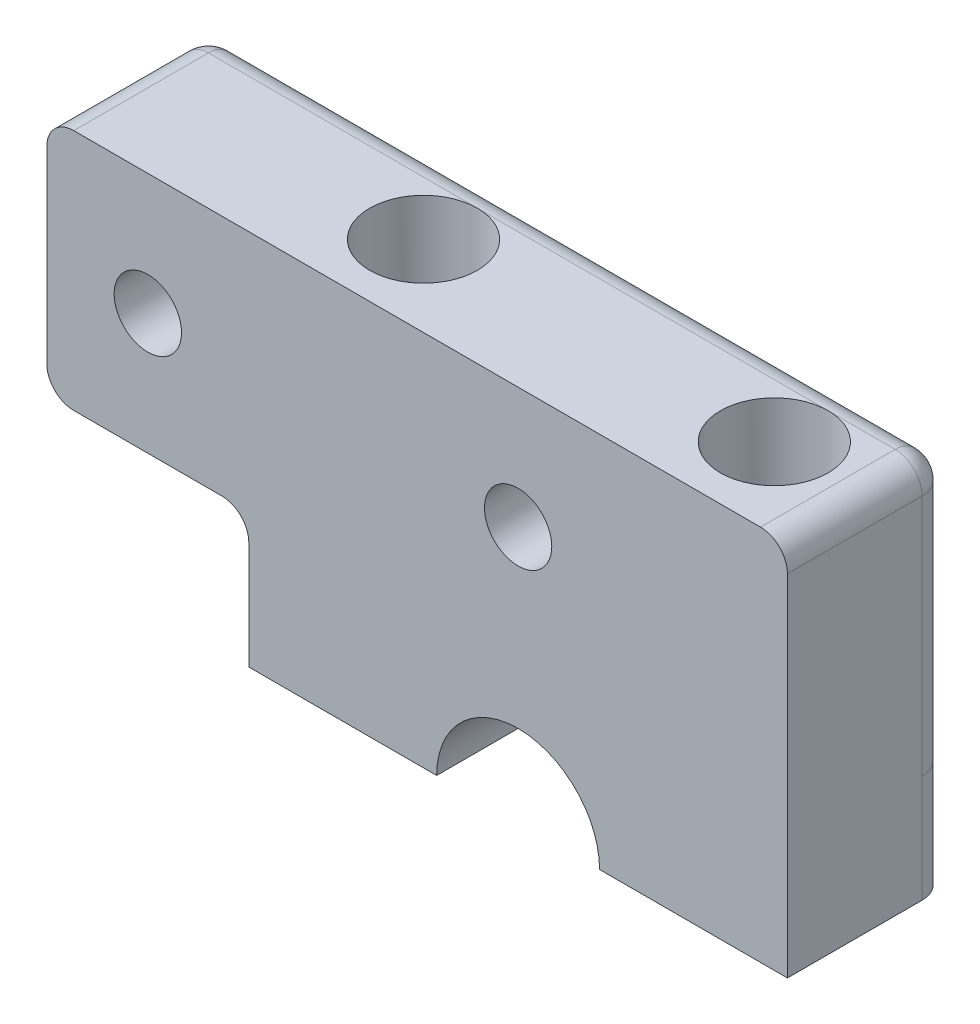
ISO-10303-21;
HEADER;
FILE_DESCRIPTION(('STEP AP214'),'2;1');
FILE_NAME('part.step','',(''),(''),'','','');
FILE_SCHEMA(('AUTOMOTIVE_DESIGN { 1 0 10303 214 1 1 1 1 }'));
ENDSEC;
DATA;
#1=APPLICATION_CONTEXT('core data for automotive mechanical design processes');
#2=APPLICATION_PROTOCOL_DEFINITION('international standard','automotive_design',2000,#1);
#3=PRODUCT_CONTEXT('',#1,'mechanical');
#4=PRODUCT('Part','Part','',(#3));
#5=PRODUCT_RELATED_PRODUCT_CATEGORY('part','',(#4));
#6=PRODUCT_DEFINITION_FORMATION('','',#4);
#7=PRODUCT_DEFINITION_CONTEXT('part definition',#1,'design');
#8=PRODUCT_DEFINITION('design','',#6,#7);
#9=PRODUCT_DEFINITION_SHAPE('','',#8);
#10=(LENGTH_UNIT() NAMED_UNIT(*) SI_UNIT(.MILLI.,.METRE.));
#11=(NAMED_UNIT(*) PLANE_ANGLE_UNIT() SI_UNIT($,.RADIAN.));
#12=(NAMED_UNIT(*) SI_UNIT($,.STERADIAN.) SOLID_ANGLE_UNIT());
#13=UNCERTAINTY_MEASURE_WITH_UNIT(LENGTH_MEASURE(1.E-05),#10,'distance_accuracy_value','');
#14=(GEOMETRIC_REPRESENTATION_CONTEXT(3) GLOBAL_UNCERTAINTY_ASSIGNED_CONTEXT((#13)) GLOBAL_UNIT_ASSIGNED_CONTEXT((#10,
#11,#12)) REPRESENTATION_CONTEXT('',''));
#15=CARTESIAN_POINT('',(0.,0.,0.));
#16=DIRECTION('',(0.,0.,1.));
#17=DIRECTION('',(1.,0.,0.));
#18=AXIS2_PLACEMENT_3D('',#15,#16,#17);
#19=CARTESIAN_POINT('',(-16.8143872425623,9.72584856396867,12.));
#20=DIRECTION('',(0.,-1.,0.));
#21=DIRECTION('',(0.,0.,-1.));
#22=AXIS2_PLACEMENT_3D('',#19,#20,#21);
#23=PLANE('',#22);
#24=DIRECTION('',(-1.,0.,0.));
#25=VECTOR('',#24,1.);
#26=CARTESIAN_POINT('',(-16.8143872425623,9.72584856396867,12.));
#27=LINE('',#26,#25);
#28=CARTESIAN_POINT('',(21.1856127574377,9.72584856396867,12.));
#29=VERTEX_POINT('',#28);
#30=CARTESIAN_POINT('',(-29.8143872425623,9.72584856396867,12.));
#31=VERTEX_POINT('',#30);
#32=EDGE_CURVE('E204',#29,#31,#27,.T.);
#33=ORIENTED_EDGE('',*,*,#32,.F.);
#34=DIRECTION('',(0.,0.,1.));
#35=VECTOR('',#34,1.);
#36=CARTESIAN_POINT('',(21.1856127574377,9.72584856396867,12.));
#37=LINE('',#36,#35);
#38=CARTESIAN_POINT('',(21.1856127574377,9.72584856396867,2.));
#39=VERTEX_POINT('',#38);
#40=EDGE_CURVE('E59',#29,#39,#37,.F.);
#41=ORIENTED_EDGE('',*,*,#40,.T.);
#42=DIRECTION('',(-1.,0.,0.));
#43=VECTOR('',#42,1.);
#44=CARTESIAN_POINT('',(-16.8143872425623,9.72584856396867,2.));
#45=LINE('',#44,#43);
#46=CARTESIAN_POINT('',(16.2106127574377,9.72584856396867,2.));
#47=VERTEX_POINT('',#46);
#48=EDGE_CURVE('E258',#39,#47,#45,.T.);
#49=ORIENTED_EDGE('',*,*,#48,.T.);
#50=CARTESIAN_POINT('',(16.2106127574377,9.72584856396867,6.));
#51=DIRECTION('',(0.,1.,0.));
#52=DIRECTION('',(0.,0.,1.));
#53=AXIS2_PLACEMENT_3D('',#50,#51,#52);
#54=CIRCLE('',#53,4.);
#55=EDGE_CURVE('E215',#47,#47,#54,.T.);
#56=ORIENTED_EDGE('',*,*,#55,.F.);
#57=DIRECTION('',(-1.,0.,0.));
#58=VECTOR('',#57,1.);
#59=CARTESIAN_POINT('',(-16.8143872425623,9.72584856396867,2.));
#60=LINE('',#59,#58);
#61=CARTESIAN_POINT('',(-9.83938724256228,9.72584856396867,2.));
#62=VERTEX_POINT('',#61);
#63=EDGE_CURVE('E256',#47,#62,#60,.T.);
#64=ORIENTED_EDGE('',*,*,#63,.T.);
#65=CARTESIAN_POINT('',(-9.83938724256228,9.72584856396867,6.));
#66=DIRECTION('',(0.,1.,0.));
#67=DIRECTION('',(0.,0.,1.));
#68=AXIS2_PLACEMENT_3D('',#65,#66,#67);
#69=CIRCLE('',#68,4.);
#70=EDGE_CURVE('E348',#62,#62,#69,.T.);
#71=ORIENTED_EDGE('',*,*,#70,.F.);
#72=DIRECTION('',(-1.,0.,0.));
#73=VECTOR('',#72,1.);
#74=CARTESIAN_POINT('',(-16.8143872425623,9.72584856396867,2.));
#75=LINE('',#74,#73);
#76=CARTESIAN_POINT('',(-29.8143872425623,9.72584856396867,2.));
#77=VERTEX_POINT('',#76);
#78=EDGE_CURVE('E254',#62,#77,#75,.T.);
#79=ORIENTED_EDGE('',*,*,#78,.T.);
#80=DIRECTION('',(0.,0.,-1.));
#81=VECTOR('',#80,1.);
#82=CARTESIAN_POINT('',(-29.8143872425623,9.72584856396867,12.));
#83=LINE('',#82,#81);
#84=EDGE_CURVE('E251',#77,#31,#83,.F.);
#85=ORIENTED_EDGE('',*,*,#84,.T.);
#86=EDGE_LOOP('',(#33,#41,#49,#56,#64,#71,#79,#85));
#87=FACE_BOUND('',#86,.T.);
#88=ADVANCED_FACE('F35',(#87),#23,.F.);
#89=CARTESIAN_POINT('',(0.,0.,12.));
#90=DIRECTION('',(0.,0.,1.));
#91=DIRECTION('',(1.,0.,0.));
#92=AXIS2_PLACEMENT_3D('',#89,#90,#91);
#93=PLANE('',#92);
#94=CARTESIAN_POINT('',(3.18561275743771,0.725848563968672,12.));
#95=DIRECTION('',(0.,0.,1.));
#96=DIRECTION('',(1.,0.,0.));
#97=AXIS2_PLACEMENT_3D('',#94,#95,#96);
#98=CIRCLE('',#97,2.5);
#99=CARTESIAN_POINT('',(5.68561275743771,0.725848563968672,12.));
#100=VERTEX_POINT('',#99);
#101=EDGE_CURVE('E210',#100,#100,#98,.T.);
#102=ORIENTED_EDGE('',*,*,#101,.F.);
#103=EDGE_LOOP('',(#102));
#104=FACE_BOUND('',#103,.T.);
#105=CARTESIAN_POINT('',(-24.3143872425623,0.725848563968672,12.));
#106=DIRECTION('',(0.,0.,1.));
#107=DIRECTION('',(1.,0.,0.));
#108=AXIS2_PLACEMENT_3D('',#105,#106,#107);
#109=CIRCLE('',#108,2.5);
#110=CARTESIAN_POINT('',(-21.8143872425623,0.725848563968672,12.));
#111=VERTEX_POINT('',#110);
#112=EDGE_CURVE('E297',#111,#111,#109,.T.);
#113=ORIENTED_EDGE('',*,*,#112,.F.);
#114=EDGE_LOOP('',(#113));
#115=FACE_BOUND('',#114,.T.);
#116=DIRECTION('',(0.,1.,0.));
#117=VECTOR('',#116,1.);
#118=CARTESIAN_POINT('',(23.1856127574377,9.72584856396867,12.));
#119=LINE('',#118,#117);
#120=CARTESIAN_POINT('',(23.1856127574377,-18.2741514360313,12.));
#121=VERTEX_POINT('',#120);
#122=CARTESIAN_POINT('',(23.1856127574377,7.72584856396867,12.));
#123=VERTEX_POINT('',#122);
#124=EDGE_CURVE('E201',#121,#123,#119,.T.);
#125=ORIENTED_EDGE('',*,*,#124,.T.);
#126=CARTESIAN_POINT('',(21.1856127574377,7.72584856396867,12.));
#127=DIRECTION('',(0.,0.,1.));
#128=DIRECTION('',(1.,0.,0.));
#129=AXIS2_PLACEMENT_3D('',#126,#127,#128);
#130=CIRCLE('',#129,2.);
#131=EDGE_CURVE('E301',#123,#29,#130,.T.);
#132=ORIENTED_EDGE('',*,*,#131,.T.);
#133=ORIENTED_EDGE('',*,*,#32,.T.);
#134=CARTESIAN_POINT('',(-29.8143872425623,7.72584856396867,12.));
#135=DIRECTION('',(0.,0.,1.));
#136=DIRECTION('',(1.,0.,0.));
#137=AXIS2_PLACEMENT_3D('',#134,#135,#136);
#138=CIRCLE('',#137,2.);
#139=CARTESIAN_POINT('',(-31.8143872425623,7.72584856396867,12.));
#140=VERTEX_POINT('',#139);
#141=EDGE_CURVE('E262',#31,#140,#138,.T.);
#142=ORIENTED_EDGE('',*,*,#141,.T.);
#143=DIRECTION('',(0.,1.,0.));
#144=VECTOR('',#143,1.);
#145=CARTESIAN_POINT('',(-31.8143872425623,9.72584856396867,12.));
#146=LINE('',#145,#144);
#147=CARTESIAN_POINT('',(-31.8143872425623,-6.27415143603133,12.));
#148=VERTEX_POINT('',#147);
#149=EDGE_CURVE('E356',#148,#140,#146,.T.);
#150=ORIENTED_EDGE('',*,*,#149,.F.);
#151=CARTESIAN_POINT('',(-29.8143872425623,-6.27415143603133,12.));
#152=DIRECTION('',(0.,0.,1.));
#153=DIRECTION('',(1.,0.,0.));
#154=AXIS2_PLACEMENT_3D('',#151,#152,#153);
#155=CIRCLE('',#154,2.);
#156=CARTESIAN_POINT('',(-29.8143872425623,-8.27415143603133,12.));
#157=VERTEX_POINT('',#156);
#158=EDGE_CURVE('E260',#148,#157,#155,.T.);
#159=ORIENTED_EDGE('',*,*,#158,.T.);
#160=DIRECTION('',(1.,0.,0.));
#161=VECTOR('',#160,1.);
#162=CARTESIAN_POINT('',(-31.8143872425623,-8.27415143603133,12.));
#163=LINE('',#162,#161);
#164=CARTESIAN_POINT('',(-18.8143872425623,-8.27415143603132,12.));
#165=VERTEX_POINT('',#164);
#166=EDGE_CURVE('E351',#157,#165,#163,.T.);
#167=ORIENTED_EDGE('',*,*,#166,.T.);
#168=CARTESIAN_POINT('',(-18.8143872425623,-10.2741514360313,12.));
#169=DIRECTION('',(0.,0.,1.));
#170=DIRECTION('',(1.,0.,0.));
#171=AXIS2_PLACEMENT_3D('',#168,#169,#170);
#172=CIRCLE('',#171,2.);
#173=CARTESIAN_POINT('',(-16.8143872425623,-10.2741514360313,12.));
#174=VERTEX_POINT('',#173);
#175=EDGE_CURVE('E264',#165,#174,#172,.F.);
#176=ORIENTED_EDGE('',*,*,#175,.T.);
#177=DIRECTION('',(0.,-1.,0.));
#178=VECTOR('',#177,1.);
#179=CARTESIAN_POINT('',(-16.8143872425623,9.72584856396867,12.));
#180=LINE('',#179,#178);
#181=CARTESIAN_POINT('',(-16.8143872425623,-18.2741514360313,12.));
#182=VERTEX_POINT('',#181);
#183=EDGE_CURVE('E171',#174,#182,#180,.T.);
#184=ORIENTED_EDGE('',*,*,#183,.T.);
#185=DIRECTION('',(-1.,0.,0.));
#186=VECTOR('',#185,1.);
#187=CARTESIAN_POINT('',(23.1856127574377,-18.2741514360313,12.));
#188=LINE('',#187,#186);
#189=CARTESIAN_POINT('',(-2.86438724256229,-18.2741514360313,12.));
#190=VERTEX_POINT('',#189);
#191=EDGE_CURVE('E194',#190,#182,#188,.T.);
#192=ORIENTED_EDGE('',*,*,#191,.F.);
#193=CARTESIAN_POINT('',(3.18561275743771,-18.2741514360313,12.));
#194=DIRECTION('',(0.,0.,1.));
#195=DIRECTION('',(-1.,0.,0.));
#196=AXIS2_PLACEMENT_3D('',#193,#194,#195);
#197=CIRCLE('',#196,6.05);
#198=CARTESIAN_POINT('',(9.23561275743771,-18.2741514360313,12.));
#199=VERTEX_POINT('',#198);
#200=EDGE_CURVE('E179',#199,#190,#197,.T.);
#201=ORIENTED_EDGE('',*,*,#200,.F.);
#202=EDGE_CURVE('E195',#121,#199,#188,.T.);
#203=ORIENTED_EDGE('',*,*,#202,.F.);
#204=EDGE_LOOP('',(#125,#132,#133,#142,#150,#159,#167,#176,#184,#192,#201,#203));
#205=FACE_BOUND('',#204,.T.);
#206=ADVANCED_FACE('F322',(#104,#115,#205),#93,.T.);
#207=CARTESIAN_POINT('',(0.,0.,0.));
#208=DIRECTION('',(0.,0.,1.));
#209=DIRECTION('',(1.,0.,0.));
#210=AXIS2_PLACEMENT_3D('',#207,#208,#209);
#211=PLANE('',#210);
#212=CARTESIAN_POINT('',(3.18561275743771,0.725848563968672,0.));
#213=DIRECTION('',(0.,0.,1.));
#214=DIRECTION('',(1.,0.,0.));
#215=AXIS2_PLACEMENT_3D('',#212,#213,#214);
#216=CIRCLE('',#215,2.5);
#217=CARTESIAN_POINT('',(5.68561275743771,0.725848563968672,0.));
#218=VERTEX_POINT('',#217);
#219=EDGE_CURVE('E363',#218,#218,#216,.T.);
#220=ORIENTED_EDGE('',*,*,#219,.T.);
#221=EDGE_LOOP('',(#220));
#222=FACE_BOUND('',#221,.T.);
#223=CARTESIAN_POINT('',(-24.3143872425623,0.725848563968672,0.));
#224=DIRECTION('',(0.,0.,1.));
#225=DIRECTION('',(1.,0.,0.));
#226=AXIS2_PLACEMENT_3D('',#223,#224,#225);
#227=CIRCLE('',#226,2.5);
#228=CARTESIAN_POINT('',(-21.8143872425623,0.725848563968672,0.));
#229=VERTEX_POINT('',#228);
#230=EDGE_CURVE('E691',#229,#229,#227,.T.);
#231=ORIENTED_EDGE('',*,*,#230,.T.);
#232=EDGE_LOOP('',(#231));
#233=FACE_BOUND('',#232,.T.);
#234=DIRECTION('',(-1.,0.,0.));
#235=VECTOR('',#234,1.);
#236=CARTESIAN_POINT('',(0.,7.72584856396867,0.));
#237=LINE('',#236,#235);
#238=CARTESIAN_POINT('',(-29.8143872425623,7.72584856396867,0.));
#239=VERTEX_POINT('',#238);
#240=CARTESIAN_POINT('',(21.1856127574377,7.72584856396867,0.));
#241=VERTEX_POINT('',#240);
#242=EDGE_CURVE('E219',#239,#241,#237,.F.);
#243=ORIENTED_EDGE('',*,*,#242,.T.);
#244=DIRECTION('',(0.,1.,0.));
#245=VECTOR('',#244,1.);
#246=CARTESIAN_POINT('',(21.1856127574377,0.,0.));
#247=LINE('',#246,#245);
#248=CARTESIAN_POINT('',(21.1856127574377,-10.2741514360313,0.));
#249=VERTEX_POINT('',#248);
#250=EDGE_CURVE('E11',#241,#249,#247,.F.);
#251=ORIENTED_EDGE('',*,*,#250,.T.);
#252=DIRECTION('',(0.,1.,0.));
#253=VECTOR('',#252,1.);
#254=CARTESIAN_POINT('',(21.1856127574377,0.,0.));
#255=LINE('',#254,#253);
#256=CARTESIAN_POINT('',(21.1856127574377,-18.2741514360313,0.));
#257=VERTEX_POINT('',#256);
#258=EDGE_CURVE('E230',#249,#257,#255,.F.);
#259=ORIENTED_EDGE('',*,*,#258,.T.);
#260=DIRECTION('',(1.,0.,0.));
#261=VECTOR('',#260,1.);
#262=CARTESIAN_POINT('',(23.1856127574377,-18.2741514360313,0.));
#263=LINE('',#262,#261);
#264=CARTESIAN_POINT('',(9.23561275743771,-18.2741514360313,0.));
#265=VERTEX_POINT('',#264);
#266=EDGE_CURVE('E172',#265,#257,#263,.T.);
#267=ORIENTED_EDGE('',*,*,#266,.F.);
#268=CARTESIAN_POINT('',(3.18561275743771,-18.2741514360313,0.));
#269=DIRECTION('',(0.,0.,1.));
#270=DIRECTION('',(-1.,0.,0.));
#271=AXIS2_PLACEMENT_3D('',#268,#269,#270);
#272=CIRCLE('',#271,6.05);
#273=CARTESIAN_POINT('',(-2.86438724256229,-18.2741514360313,0.));
#274=VERTEX_POINT('',#273);
#275=EDGE_CURVE('E176',#265,#274,#272,.T.);
#276=ORIENTED_EDGE('',*,*,#275,.T.);
#277=CARTESIAN_POINT('',(-14.8143872425623,-18.2741514360313,0.));
#278=VERTEX_POINT('',#277);
#279=EDGE_CURVE('E159',#278,#274,#263,.T.);
#280=ORIENTED_EDGE('',*,*,#279,.F.);
#281=DIRECTION('',(0.,-1.,0.));
#282=VECTOR('',#281,1.);
#283=CARTESIAN_POINT('',(-14.8143872425623,0.,0.));
#284=LINE('',#283,#282);
#285=CARTESIAN_POINT('',(-14.8143872425623,-10.2741514360313,0.));
#286=VERTEX_POINT('',#285);
#287=EDGE_CURVE('E228',#278,#286,#284,.F.);
#288=ORIENTED_EDGE('',*,*,#287,.T.);
#289=CARTESIAN_POINT('',(-18.8143872425623,-10.2741514360313,0.));
#290=DIRECTION('',(0.,0.,1.));
#291=DIRECTION('',(1.,0.,0.));
#292=AXIS2_PLACEMENT_3D('',#289,#290,#291);
#293=CIRCLE('',#292,4.);
#294=CARTESIAN_POINT('',(-18.8143872425623,-6.27415143603132,0.));
#295=VERTEX_POINT('',#294);
#296=EDGE_CURVE('E225',#295,#286,#293,.F.);
#297=ORIENTED_EDGE('',*,*,#296,.F.);
#298=DIRECTION('',(1.,0.,0.));
#299=VECTOR('',#298,1.);
#300=CARTESIAN_POINT('',(0.,-6.27415143603132,0.));
#301=LINE('',#300,#299);
#302=CARTESIAN_POINT('',(-29.8143872425623,-6.27415143603133,0.));
#303=VERTEX_POINT('',#302);
#304=EDGE_CURVE('E223',#295,#303,#301,.F.);
#305=ORIENTED_EDGE('',*,*,#304,.T.);
#306=DIRECTION('',(0.,-1.,0.));
#307=VECTOR('',#306,1.);
#308=CARTESIAN_POINT('',(-29.8143872425623,9.72584856396867,0.));
#309=LINE('',#308,#307);
#310=EDGE_CURVE('E221',#303,#239,#309,.F.);
#311=ORIENTED_EDGE('',*,*,#310,.T.);
#312=EDGE_LOOP('',(#243,#251,#259,#267,#276,#280,#288,#297,#305,#311));
#313=FACE_BOUND('',#312,.T.);
#314=ADVANCED_FACE('F183',(#222,#233,#313),#211,.F.);
#315=CARTESIAN_POINT('',(-16.8143872425623,7.72584856396867,2.));
#316=DIRECTION('',(-1.,0.,0.));
#317=DIRECTION('',(0.,0.,1.));
#318=AXIS2_PLACEMENT_3D('',#315,#316,#317);
#319=CYLINDRICAL_SURFACE('',#318,2.);
#320=ORIENTED_EDGE('',*,*,#48,.F.);
#321=CARTESIAN_POINT('',(21.1856127574377,7.72584856396867,2.));
#322=DIRECTION('',(-1.,0.,0.));
#323=DIRECTION('',(0.,0.,1.));
#324=AXIS2_PLACEMENT_3D('',#321,#322,#323);
#325=CIRCLE('',#324,2.);
#326=EDGE_CURVE('E44',#39,#241,#325,.T.);
#327=ORIENTED_EDGE('',*,*,#326,.T.);
#328=ORIENTED_EDGE('',*,*,#242,.F.);
#329=CARTESIAN_POINT('',(-29.8143872425623,7.72584856396867,2.));
#330=DIRECTION('',(-1.,0.,0.));
#331=DIRECTION('',(0.,0.,1.));
#332=AXIS2_PLACEMENT_3D('',#329,#330,#331);
#333=CIRCLE('',#332,2.);
#334=EDGE_CURVE('E270',#239,#77,#333,.F.);
#335=ORIENTED_EDGE('',*,*,#334,.T.);
#336=ORIENTED_EDGE('',*,*,#78,.F.);
#337=ORIENTED_EDGE('',*,*,#63,.F.);
#338=EDGE_LOOP('',(#320,#327,#328,#335,#336,#337));
#339=FACE_BOUND('',#338,.T.);
#340=ADVANCED_FACE('F334',(#339),#319,.T.);
#341=CARTESIAN_POINT('',(23.1856127574377,9.72584856396867,12.));
#342=DIRECTION('',(-1.,0.,0.));
#343=DIRECTION('',(0.,0.,1.));
#344=AXIS2_PLACEMENT_3D('',#341,#342,#343);
#345=PLANE('',#344);
#346=DIRECTION('',(0.,1.,0.));
#347=VECTOR('',#346,1.);
#348=CARTESIAN_POINT('',(23.1856127574377,9.72584856396867,2.));
#349=LINE('',#348,#347);
#350=CARTESIAN_POINT('',(23.1856127574377,-10.2741514360313,2.));
#351=VERTEX_POINT('',#350);
#352=CARTESIAN_POINT('',(23.1856127574377,7.72584856396867,2.));
#353=VERTEX_POINT('',#352);
#354=EDGE_CURVE('E266',#351,#353,#349,.T.);
#355=ORIENTED_EDGE('',*,*,#354,.T.);
#356=DIRECTION('',(0.,0.,1.));
#357=VECTOR('',#356,1.);
#358=CARTESIAN_POINT('',(23.1856127574377,7.72584856396867,12.));
#359=LINE('',#358,#357);
#360=EDGE_CURVE('E299',#353,#123,#359,.T.);
#361=ORIENTED_EDGE('',*,*,#360,.T.);
#362=ORIENTED_EDGE('',*,*,#124,.F.);
#363=DIRECTION('',(0.,0.,1.));
#364=VECTOR('',#363,1.);
#365=CARTESIAN_POINT('',(23.1856127574377,-18.2741514360313,0.));
#366=LINE('',#365,#364);
#367=CARTESIAN_POINT('',(23.1856127574377,-18.2741514360313,2.));
#368=VERTEX_POINT('',#367);
#369=EDGE_CURVE('E191',#368,#121,#366,.T.);
#370=ORIENTED_EDGE('',*,*,#369,.F.);
#371=DIRECTION('',(0.,1.,0.));
#372=VECTOR('',#371,1.);
#373=CARTESIAN_POINT('',(23.1856127574377,9.72584856396867,2.));
#374=LINE('',#373,#372);
#375=EDGE_CURVE('E206',#368,#351,#374,.T.);
#376=ORIENTED_EDGE('',*,*,#375,.T.);
#377=EDGE_LOOP('',(#355,#361,#362,#370,#376));
#378=FACE_BOUND('',#377,.T.);
#379=ADVANCED_FACE('F318',(#378),#345,.F.);
#380=CARTESIAN_POINT('',(-16.8143872425623,9.72584856396867,12.));
#381=DIRECTION('',(1.,0.,0.));
#382=DIRECTION('',(0.,1.,0.));
#383=AXIS2_PLACEMENT_3D('',#380,#381,#382);
#384=PLANE('',#383);
#385=DIRECTION('',(0.,0.,1.));
#386=VECTOR('',#385,1.);
#387=CARTESIAN_POINT('',(-16.8143872425623,-10.2741514360313,0.));
#388=LINE('',#387,#386);
#389=CARTESIAN_POINT('',(-16.8143872425623,-10.2741514360313,2.));
#390=VERTEX_POINT('',#389);
#391=EDGE_CURVE('E234',#174,#390,#388,.F.);
#392=ORIENTED_EDGE('',*,*,#391,.T.);
#393=DIRECTION('',(0.,-1.,0.));
#394=VECTOR('',#393,1.);
#395=CARTESIAN_POINT('',(-16.8143872425623,9.72584856396867,2.));
#396=LINE('',#395,#394);
#397=CARTESIAN_POINT('',(-16.8143872425623,-18.2741514360313,2.));
#398=VERTEX_POINT('',#397);
#399=EDGE_CURVE('E236',#390,#398,#396,.T.);
#400=ORIENTED_EDGE('',*,*,#399,.T.);
#401=DIRECTION('',(0.,0.,-1.));
#402=VECTOR('',#401,1.);
#403=CARTESIAN_POINT('',(-16.8143872425623,-18.2741514360313,0.));
#404=LINE('',#403,#402);
#405=EDGE_CURVE('E198',#182,#398,#404,.T.);
#406=ORIENTED_EDGE('',*,*,#405,.F.);
#407=ORIENTED_EDGE('',*,*,#183,.F.);
#408=EDGE_LOOP('',(#392,#400,#406,#407));
#409=FACE_BOUND('',#408,.T.);
#410=ADVANCED_FACE('F398',(#409),#384,.F.);
#411=CARTESIAN_POINT('',(-9.83938724256228,9.72584856396867,6.));
#412=DIRECTION('',(0.,-1.,0.));
#413=DIRECTION('',(0.,0.,-1.));
#414=AXIS2_PLACEMENT_3D('',#411,#412,#413);
#415=CYLINDRICAL_SURFACE('',#414,2.5);
#416=CARTESIAN_POINT('',(-9.83938724256228,-18.2741514360313,6.));
#417=DIRECTION('',(0.,-1.,0.));
#418=DIRECTION('',(0.,0.,-1.));
#419=AXIS2_PLACEMENT_3D('',#416,#417,#418);
#420=CIRCLE('',#419,2.5);
#421=CARTESIAN_POINT('',(-9.83938724256228,-18.2741514360313,3.5));
#422=VERTEX_POINT('',#421);
#423=EDGE_CURVE('E186',#422,#422,#420,.T.);
#424=CARTESIAN_POINT('',(-9.83938724256228,-2.27415143603133,6.));
#425=DIRECTION('',(0.,1.,0.));
#426=DIRECTION('',(0.,0.,1.));
#427=AXIS2_PLACEMENT_3D('',#424,#425,#426);
#428=CIRCLE('',#427,2.5);
#429=CARTESIAN_POINT('',(-9.83938724256228,-2.27415143603133,3.5));
#430=VERTEX_POINT('',#429);
#431=EDGE_CURVE('E212',#430,#430,#428,.F.);
#432=CARTESIAN_POINT('',(-9.83938724256228,-18.2741514360313,3.5));
#433=CARTESIAN_POINT('',(-9.83938724256228,-18.1074847693647,3.5));
#434=CARTESIAN_POINT('',(-9.83938724256228,-17.940818102698,3.5));
#435=CARTESIAN_POINT('',(-9.83938724256228,-17.6074847693647,3.5));
#436=CARTESIAN_POINT('',(-9.83938724256228,-17.440818102698,3.5));
#437=CARTESIAN_POINT('',(-9.83938724256228,-17.1074847693647,3.5));
#438=CARTESIAN_POINT('',(-9.83938724256228,-16.940818102698,3.5));
#439=CARTESIAN_POINT('',(-9.83938724256228,-16.6074847693647,3.5));
#440=CARTESIAN_POINT('',(-9.83938724256228,-16.440818102698,3.5));
#441=CARTESIAN_POINT('',(-9.83938724256228,-16.1074847693647,3.5));
#442=CARTESIAN_POINT('',(-9.83938724256228,-15.940818102698,3.5));
#443=CARTESIAN_POINT('',(-9.83938724256228,-15.6074847693647,3.5));
#444=CARTESIAN_POINT('',(-9.83938724256228,-15.440818102698,3.5));
#445=CARTESIAN_POINT('',(-9.83938724256228,-15.1074847693647,3.5));
#446=CARTESIAN_POINT('',(-9.83938724256228,-14.940818102698,3.5));
#447=CARTESIAN_POINT('',(-9.83938724256228,-14.6074847693647,3.5));
#448=CARTESIAN_POINT('',(-9.83938724256228,-14.440818102698,3.5));
#449=CARTESIAN_POINT('',(-9.83938724256228,-14.1074847693647,3.5));
#450=CARTESIAN_POINT('',(-9.83938724256228,-13.940818102698,3.5));
#451=CARTESIAN_POINT('',(-9.83938724256228,-13.6074847693647,3.5));
#452=CARTESIAN_POINT('',(-9.83938724256228,-13.440818102698,3.5));
#453=CARTESIAN_POINT('',(-9.83938724256228,-13.1074847693647,3.5));
#454=CARTESIAN_POINT('',(-9.83938724256228,-12.940818102698,3.5));
#455=CARTESIAN_POINT('',(-9.83938724256228,-12.6074847693647,3.5));
#456=CARTESIAN_POINT('',(-9.83938724256228,-12.440818102698,3.5));
#457=CARTESIAN_POINT('',(-9.83938724256228,-12.1074847693647,3.5));
#458=CARTESIAN_POINT('',(-9.83938724256228,-11.940818102698,3.5));
#459=CARTESIAN_POINT('',(-9.83938724256228,-11.6074847693647,3.5));
#460=CARTESIAN_POINT('',(-9.83938724256228,-11.440818102698,3.5));
#461=CARTESIAN_POINT('',(-9.83938724256228,-11.1074847693647,3.5));
#462=CARTESIAN_POINT('',(-9.83938724256228,-10.940818102698,3.5));
#463=CARTESIAN_POINT('',(-9.83938724256228,-10.6074847693647,3.5));
#464=CARTESIAN_POINT('',(-9.83938724256228,-10.440818102698,3.5));
#465=CARTESIAN_POINT('',(-9.83938724256228,-10.1074847693647,3.5));
#466=CARTESIAN_POINT('',(-9.83938724256228,-9.94081810269799,3.5));
#467=CARTESIAN_POINT('',(-9.83938724256228,-9.60748476936466,3.5));
#468=CARTESIAN_POINT('',(-9.83938724256228,-9.44081810269799,3.5));
#469=CARTESIAN_POINT('',(-9.83938724256228,-9.10748476936466,3.5));
#470=CARTESIAN_POINT('',(-9.83938724256228,-8.94081810269799,3.5));
#471=CARTESIAN_POINT('',(-9.83938724256228,-8.60748476936466,3.5));
#472=CARTESIAN_POINT('',(-9.83938724256228,-8.44081810269799,3.5));
#473=CARTESIAN_POINT('',(-9.83938724256228,-8.10748476936466,3.5));
#474=CARTESIAN_POINT('',(-9.83938724256228,-7.94081810269799,3.5));
#475=CARTESIAN_POINT('',(-9.83938724256228,-7.60748476936466,3.5));
#476=CARTESIAN_POINT('',(-9.83938724256228,-7.44081810269799,3.5));
#477=CARTESIAN_POINT('',(-9.83938724256228,-7.10748476936466,3.5));
#478=CARTESIAN_POINT('',(-9.83938724256228,-6.94081810269799,3.5));
#479=CARTESIAN_POINT('',(-9.83938724256228,-6.60748476936466,3.5));
#480=CARTESIAN_POINT('',(-9.83938724256228,-6.44081810269799,3.5));
#481=CARTESIAN_POINT('',(-9.83938724256228,-6.10748476936466,3.5));
#482=CARTESIAN_POINT('',(-9.83938724256228,-5.94081810269799,3.5));
#483=CARTESIAN_POINT('',(-9.83938724256228,-5.60748476936466,3.5));
#484=CARTESIAN_POINT('',(-9.83938724256228,-5.44081810269799,3.5));
#485=CARTESIAN_POINT('',(-9.83938724256228,-5.10748476936466,3.5));
#486=CARTESIAN_POINT('',(-9.83938724256228,-4.94081810269799,3.5));
#487=CARTESIAN_POINT('',(-9.83938724256228,-4.60748476936466,3.5));
#488=CARTESIAN_POINT('',(-9.83938724256228,-4.44081810269799,3.5));
#489=CARTESIAN_POINT('',(-9.83938724256228,-4.10748476936466,3.5));
#490=CARTESIAN_POINT('',(-9.83938724256228,-3.94081810269799,3.5));
#491=CARTESIAN_POINT('',(-9.83938724256228,-3.60748476936466,3.5));
#492=CARTESIAN_POINT('',(-9.83938724256228,-3.44081810269799,3.5));
#493=CARTESIAN_POINT('',(-9.83938724256228,-3.10748476936466,3.5));
#494=CARTESIAN_POINT('',(-9.83938724256228,-2.94081810269799,3.5));
#495=CARTESIAN_POINT('',(-9.83938724256228,-2.60748476936466,3.5));
#496=CARTESIAN_POINT('',(-9.83938724256228,-2.44081810269799,3.5));
#497=CARTESIAN_POINT('',(-9.83938724256228,-2.27415143603133,3.5));
#498=B_SPLINE_CURVE_WITH_KNOTS('',3,(#432,#433,#434,#435,#436,#437,#438,#439,#440,#441,#442,
#443,#444,#445,#446,#447,#448,#449,#450,#451,#452,#453,#454,#455,#456,#457,#458,#459,#460,#461,
#462,#463,#464,#465,#466,#467,#468,#469,#470,#471,#472,#473,#474,#475,#476,#477,#478,#479,#480,
#481,#482,#483,#484,#485,#486,#487,#488,#489,#490,#491,#492,#493,#494,#495,#496,#497),
.UNSPECIFIED.,.F.,.F.,(4,2,2,2,2,2,2,2,2,2,2,2,2,2,2,2,2,2,2,2,2,2,2,2,2,2,2,2,2,2,2,2,4),(0.,
0.5,1.,1.5,2.,2.5,3.,3.5,4.,4.5,5.,5.5,6.,6.5,7.,7.5,8.,8.5,9.,9.5,10.,10.5,11.,11.5,12.,12.5,
13.,13.5,14.,14.5,15.,15.5,16.),.UNSPECIFIED.);
#499=EDGE_CURVE('BSEAM374',#422,#430,#498,.T.);
#500=ORIENTED_EDGE('',*,*,#423,.T.);
#501=ORIENTED_EDGE('',*,*,#431,.F.);
#502=ORIENTED_EDGE('',*,*,#499,.T.);
#503=ORIENTED_EDGE('',*,*,#499,.F.);
#504=EDGE_LOOP('',(#500,#502,#501,#503));
#505=FACE_BOUND('',#504,.T.);
#506=ADVANCED_FACE('F374',(#505),#415,.F.);
#507=CARTESIAN_POINT('',(16.2106127574377,9.72584856396867,6.));
#508=DIRECTION('',(0.,-1.,0.));
#509=DIRECTION('',(0.,0.,-1.));
#510=AXIS2_PLACEMENT_3D('',#507,#508,#509);
#511=CYLINDRICAL_SURFACE('',#510,2.5);
#512=CARTESIAN_POINT('',(16.2106127574377,-18.2741514360313,6.));
#513=DIRECTION('',(0.,-1.,0.));
#514=DIRECTION('',(0.,0.,-1.));
#515=AXIS2_PLACEMENT_3D('',#512,#513,#514);
#516=CIRCLE('',#515,2.5);
#517=CARTESIAN_POINT('',(16.2106127574377,-18.2741514360313,3.5));
#518=VERTEX_POINT('',#517);
#519=EDGE_CURVE('E366',#518,#518,#516,.T.);
#520=CARTESIAN_POINT('',(16.2106127574377,-2.27415143603133,6.));
#521=DIRECTION('',(0.,1.,0.));
#522=DIRECTION('',(0.,0.,1.));
#523=AXIS2_PLACEMENT_3D('',#520,#521,#522);
#524=CIRCLE('',#523,2.5);
#525=CARTESIAN_POINT('',(16.2106127574377,-2.27415143603133,3.5));
#526=VERTEX_POINT('',#525);
#527=EDGE_CURVE('E207',#526,#526,#524,.F.);
#528=CARTESIAN_POINT('',(16.2106127574377,-18.2741514360313,3.5));
#529=CARTESIAN_POINT('',(16.2106127574377,-18.1074847693647,3.5));
#530=CARTESIAN_POINT('',(16.2106127574377,-17.940818102698,3.5));
#531=CARTESIAN_POINT('',(16.2106127574377,-17.6074847693647,3.5));
#532=CARTESIAN_POINT('',(16.2106127574377,-17.440818102698,3.5));
#533=CARTESIAN_POINT('',(16.2106127574377,-17.1074847693647,3.5));
#534=CARTESIAN_POINT('',(16.2106127574377,-16.940818102698,3.5));
#535=CARTESIAN_POINT('',(16.2106127574377,-16.6074847693647,3.5));
#536=CARTESIAN_POINT('',(16.2106127574377,-16.440818102698,3.5));
#537=CARTESIAN_POINT('',(16.2106127574377,-16.1074847693647,3.5));
#538=CARTESIAN_POINT('',(16.2106127574377,-15.940818102698,3.5));
#539=CARTESIAN_POINT('',(16.2106127574377,-15.6074847693647,3.5));
#540=CARTESIAN_POINT('',(16.2106127574377,-15.440818102698,3.5));
#541=CARTESIAN_POINT('',(16.2106127574377,-15.1074847693647,3.5));
#542=CARTESIAN_POINT('',(16.2106127574377,-14.940818102698,3.5));
#543=CARTESIAN_POINT('',(16.2106127574377,-14.6074847693647,3.5));
#544=CARTESIAN_POINT('',(16.2106127574377,-14.440818102698,3.5));
#545=CARTESIAN_POINT('',(16.2106127574377,-14.1074847693647,3.5));
#546=CARTESIAN_POINT('',(16.2106127574377,-13.940818102698,3.5));
#547=CARTESIAN_POINT('',(16.2106127574377,-13.6074847693647,3.5));
#548=CARTESIAN_POINT('',(16.2106127574377,-13.440818102698,3.5));
#549=CARTESIAN_POINT('',(16.2106127574377,-13.1074847693647,3.5));
#550=CARTESIAN_POINT('',(16.2106127574377,-12.940818102698,3.5));
#551=CARTESIAN_POINT('',(16.2106127574377,-12.6074847693647,3.5));
#552=CARTESIAN_POINT('',(16.2106127574377,-12.440818102698,3.5));
#553=CARTESIAN_POINT('',(16.2106127574377,-12.1074847693647,3.5));
#554=CARTESIAN_POINT('',(16.2106127574377,-11.940818102698,3.5));
#555=CARTESIAN_POINT('',(16.2106127574377,-11.6074847693647,3.5));
#556=CARTESIAN_POINT('',(16.2106127574377,-11.440818102698,3.5));
#557=CARTESIAN_POINT('',(16.2106127574377,-11.1074847693647,3.5));
#558=CARTESIAN_POINT('',(16.2106127574377,-10.940818102698,3.5));
#559=CARTESIAN_POINT('',(16.2106127574377,-10.6074847693647,3.5));
#560=CARTESIAN_POINT('',(16.2106127574377,-10.440818102698,3.5));
#561=CARTESIAN_POINT('',(16.2106127574377,-10.1074847693647,3.5));
#562=CARTESIAN_POINT('',(16.2106127574377,-9.94081810269799,3.5));
#563=CARTESIAN_POINT('',(16.2106127574377,-9.60748476936466,3.5));
#564=CARTESIAN_POINT('',(16.2106127574377,-9.44081810269799,3.5));
#565=CARTESIAN_POINT('',(16.2106127574377,-9.10748476936466,3.5));
#566=CARTESIAN_POINT('',(16.2106127574377,-8.94081810269799,3.5));
#567=CARTESIAN_POINT('',(16.2106127574377,-8.60748476936466,3.5));
#568=CARTESIAN_POINT('',(16.2106127574377,-8.44081810269799,3.5));
#569=CARTESIAN_POINT('',(16.2106127574377,-8.10748476936466,3.5));
#570=CARTESIAN_POINT('',(16.2106127574377,-7.94081810269799,3.5));
#571=CARTESIAN_POINT('',(16.2106127574377,-7.60748476936466,3.5));
#572=CARTESIAN_POINT('',(16.2106127574377,-7.44081810269799,3.5));
#573=CARTESIAN_POINT('',(16.2106127574377,-7.10748476936466,3.5));
#574=CARTESIAN_POINT('',(16.2106127574377,-6.94081810269799,3.5));
#575=CARTESIAN_POINT('',(16.2106127574377,-6.60748476936466,3.5));
#576=CARTESIAN_POINT('',(16.2106127574377,-6.44081810269799,3.5));
#577=CARTESIAN_POINT('',(16.2106127574377,-6.10748476936466,3.5));
#578=CARTESIAN_POINT('',(16.2106127574377,-5.94081810269799,3.5));
#579=CARTESIAN_POINT('',(16.2106127574377,-5.60748476936466,3.5));
#580=CARTESIAN_POINT('',(16.2106127574377,-5.44081810269799,3.5));
#581=CARTESIAN_POINT('',(16.2106127574377,-5.10748476936466,3.5));
#582=CARTESIAN_POINT('',(16.2106127574377,-4.94081810269799,3.5));
#583=CARTESIAN_POINT('',(16.2106127574377,-4.60748476936466,3.5));
#584=CARTESIAN_POINT('',(16.2106127574377,-4.44081810269799,3.5));
#585=CARTESIAN_POINT('',(16.2106127574377,-4.10748476936466,3.5));
#586=CARTESIAN_POINT('',(16.2106127574377,-3.94081810269799,3.5));
#587=CARTESIAN_POINT('',(16.2106127574377,-3.60748476936466,3.5));
#588=CARTESIAN_POINT('',(16.2106127574377,-3.44081810269799,3.5));
#589=CARTESIAN_POINT('',(16.2106127574377,-3.10748476936466,3.5));
#590=CARTESIAN_POINT('',(16.2106127574377,-2.94081810269799,3.5));
#591=CARTESIAN_POINT('',(16.2106127574377,-2.60748476936466,3.5));
#592=CARTESIAN_POINT('',(16.2106127574377,-2.44081810269799,3.5));
#593=CARTESIAN_POINT('',(16.2106127574377,-2.27415143603133,3.5));
#594=B_SPLINE_CURVE_WITH_KNOTS('',3,(#528,#529,#530,#531,#532,#533,#534,#535,#536,#537,#538,
#539,#540,#541,#542,#543,#544,#545,#546,#547,#548,#549,#550,#551,#552,#553,#554,#555,#556,#557,
#558,#559,#560,#561,#562,#563,#564,#565,#566,#567,#568,#569,#570,#571,#572,#573,#574,#575,#576,
#577,#578,#579,#580,#581,#582,#583,#584,#585,#586,#587,#588,#589,#590,#591,#592,#593),
.UNSPECIFIED.,.F.,.F.,(4,2,2,2,2,2,2,2,2,2,2,2,2,2,2,2,2,2,2,2,2,2,2,2,2,2,2,2,2,2,2,2,4),(0.,
0.5,1.,1.5,2.,2.5,3.,3.5,4.,4.5,5.,5.5,6.,6.5,7.,7.5,8.,8.5,9.,9.5,10.,10.5,11.,11.5,12.,12.5,
13.,13.5,14.,14.5,15.,15.5,16.),.UNSPECIFIED.);
#595=EDGE_CURVE('BSEAM385',#518,#526,#594,.T.);
#596=ORIENTED_EDGE('',*,*,#519,.T.);
#597=ORIENTED_EDGE('',*,*,#527,.F.);
#598=ORIENTED_EDGE('',*,*,#595,.T.);
#599=ORIENTED_EDGE('',*,*,#595,.F.);
#600=EDGE_LOOP('',(#596,#598,#597,#599));
#601=FACE_BOUND('',#600,.T.);
#602=ADVANCED_FACE('F385',(#601),#511,.F.);
#603=CARTESIAN_POINT('',(0.,-18.2741514360313,0.));
#604=DIRECTION('',(0.,-1.,0.));
#605=DIRECTION('',(0.,0.,-1.));
#606=AXIS2_PLACEMENT_3D('',#603,#604,#605);
#607=PLANE('',#606);
#608=ORIENTED_EDGE('',*,*,#519,.F.);
#609=EDGE_LOOP('',(#608));
#610=FACE_BOUND('',#609,.T.);
#611=ORIENTED_EDGE('',*,*,#266,.T.);
#612=CARTESIAN_POINT('',(21.1856127574377,-18.2741514360313,2.));
#613=DIRECTION('',(0.,-1.,0.));
#614=DIRECTION('',(0.,0.,-1.));
#615=AXIS2_PLACEMENT_3D('',#612,#613,#614);
#616=CIRCLE('',#615,2.);
#617=EDGE_CURVE('E232',#257,#368,#616,.T.);
#618=ORIENTED_EDGE('',*,*,#617,.T.);
#619=ORIENTED_EDGE('',*,*,#369,.T.);
#620=ORIENTED_EDGE('',*,*,#202,.T.);
#621=DIRECTION('',(0.,0.,1.));
#622=VECTOR('',#621,1.);
#623=CARTESIAN_POINT('',(9.23561275743771,-18.2741514360313,0.));
#624=LINE('',#623,#622);
#625=EDGE_CURVE('E180',#265,#199,#624,.T.);
#626=ORIENTED_EDGE('',*,*,#625,.F.);
#627=EDGE_LOOP('',(#611,#618,#619,#620,#626));
#628=FACE_BOUND('',#627,.T.);
#629=ADVANCED_FACE('F324',(#610,#628),#607,.T.);
#630=ORIENTED_EDGE('',*,*,#423,.F.);
#631=EDGE_LOOP('',(#630));
#632=FACE_BOUND('',#631,.T.);
#633=ORIENTED_EDGE('',*,*,#405,.T.);
#634=CARTESIAN_POINT('',(-14.8143872425623,-18.2741514360313,2.));
#635=DIRECTION('',(0.,-1.,0.));
#636=DIRECTION('',(0.,0.,-1.));
#637=AXIS2_PLACEMENT_3D('',#634,#635,#636);
#638=CIRCLE('',#637,2.);
#639=EDGE_CURVE('E167',#398,#278,#638,.T.);
#640=ORIENTED_EDGE('',*,*,#639,.T.);
#641=ORIENTED_EDGE('',*,*,#279,.T.);
#642=DIRECTION('',(0.,0.,1.));
#643=VECTOR('',#642,1.);
#644=CARTESIAN_POINT('',(-2.86438724256229,-18.2741514360313,0.));
#645=LINE('',#644,#643);
#646=EDGE_CURVE('E164',#274,#190,#645,.T.);
#647=ORIENTED_EDGE('',*,*,#646,.T.);
#648=ORIENTED_EDGE('',*,*,#191,.T.);
#649=EDGE_LOOP('',(#633,#640,#641,#647,#648));
#650=FACE_BOUND('',#649,.T.);
#651=ADVANCED_FACE('F162',(#632,#650),#607,.T.);
#652=CARTESIAN_POINT('',(3.18561275743771,-18.2741514360313,0.));
#653=DIRECTION('',(0.,0.,1.));
#654=DIRECTION('',(1.,0.,0.));
#655=AXIS2_PLACEMENT_3D('',#652,#653,#654);
#656=CYLINDRICAL_SURFACE('',#655,6.05);
#657=ORIENTED_EDGE('',*,*,#200,.T.);
#658=ORIENTED_EDGE('',*,*,#646,.F.);
#659=ORIENTED_EDGE('',*,*,#275,.F.);
#660=ORIENTED_EDGE('',*,*,#625,.T.);
#661=EDGE_LOOP('',(#657,#658,#659,#660));
#662=FACE_BOUND('',#661,.T.);
#663=ADVANCED_FACE('F175',(#662),#656,.F.);
#664=CARTESIAN_POINT('',(3.18561275743771,0.725848563968672,0.));
#665=DIRECTION('',(0.,0.,1.));
#666=DIRECTION('',(1.,0.,0.));
#667=AXIS2_PLACEMENT_3D('',#664,#665,#666);
#668=CYLINDRICAL_SURFACE('',#667,2.5);
#669=ORIENTED_EDGE('',*,*,#219,.F.);
#670=EDGE_LOOP('',(#669));
#671=FACE_BOUND('',#670,.T.);
#672=ORIENTED_EDGE('',*,*,#101,.T.);
#673=EDGE_LOOP('',(#672));
#674=FACE_BOUND('',#673,.T.);
#675=ADVANCED_FACE('F383',(#671,#674),#668,.F.);
#676=CARTESIAN_POINT('',(16.2106127574377,-2.27415143603133,6.));
#677=DIRECTION('',(0.,1.,0.));
#678=DIRECTION('',(0.,0.,1.));
#679=AXIS2_PLACEMENT_3D('',#676,#677,#678);
#680=PLANE('',#679);
#681=CARTESIAN_POINT('',(16.2106127574377,-2.27415143603133,6.));
#682=DIRECTION('',(0.,1.,0.));
#683=DIRECTION('',(0.,0.,1.));
#684=AXIS2_PLACEMENT_3D('',#681,#682,#683);
#685=CIRCLE('',#684,4.);
#686=CARTESIAN_POINT('',(16.2106127574377,-2.27415143603133,10.));
#687=VERTEX_POINT('',#686);
#688=EDGE_CURVE('E211',#687,#687,#685,.T.);
#689=ORIENTED_EDGE('',*,*,#688,.T.);
#690=EDGE_LOOP('',(#689));
#691=FACE_BOUND('',#690,.T.);
#692=ORIENTED_EDGE('',*,*,#527,.T.);
#693=EDGE_LOOP('',(#692));
#694=FACE_BOUND('',#693,.T.);
#695=ADVANCED_FACE('F535',(#691,#694),#680,.T.);
#696=CARTESIAN_POINT('',(16.2106127574377,-2.27415143603133,6.));
#697=DIRECTION('',(0.,1.,0.));
#698=DIRECTION('',(0.,0.,1.));
#699=AXIS2_PLACEMENT_3D('',#696,#697,#698);
#700=CYLINDRICAL_SURFACE('',#699,4.);
#701=ORIENTED_EDGE('',*,*,#688,.F.);
#702=EDGE_LOOP('',(#701));
#703=FACE_BOUND('',#702,.T.);
#704=ORIENTED_EDGE('',*,*,#55,.T.);
#705=EDGE_LOOP('',(#704));
#706=FACE_BOUND('',#705,.T.);
#707=ADVANCED_FACE('F527',(#703,#706),#700,.F.);
#708=CARTESIAN_POINT('',(-9.83938724256228,-2.27415143603133,6.));
#709=DIRECTION('',(0.,1.,0.));
#710=DIRECTION('',(0.,0.,1.));
#711=AXIS2_PLACEMENT_3D('',#708,#709,#710);
#712=PLANE('',#711);
#713=CARTESIAN_POINT('',(-9.83938724256228,-2.27415143603133,6.));
#714=DIRECTION('',(0.,1.,0.));
#715=DIRECTION('',(0.,0.,1.));
#716=AXIS2_PLACEMENT_3D('',#713,#714,#715);
#717=CIRCLE('',#716,4.);
#718=CARTESIAN_POINT('',(-9.83938724256228,-2.27415143603133,10.));
#719=VERTEX_POINT('',#718);
#720=EDGE_CURVE('E216',#719,#719,#717,.T.);
#721=ORIENTED_EDGE('',*,*,#720,.T.);
#722=EDGE_LOOP('',(#721));
#723=FACE_BOUND('',#722,.T.);
#724=ORIENTED_EDGE('',*,*,#431,.T.);
#725=EDGE_LOOP('',(#724));
#726=FACE_BOUND('',#725,.T.);
#727=ADVANCED_FACE('F519',(#723,#726),#712,.T.);
#728=CARTESIAN_POINT('',(-9.83938724256228,-2.27415143603133,6.));
#729=DIRECTION('',(0.,1.,0.));
#730=DIRECTION('',(0.,0.,1.));
#731=AXIS2_PLACEMENT_3D('',#728,#729,#730);
#732=CYLINDRICAL_SURFACE('',#731,4.);
#733=ORIENTED_EDGE('',*,*,#720,.F.);
#734=EDGE_LOOP('',(#733));
#735=FACE_BOUND('',#734,.T.);
#736=ORIENTED_EDGE('',*,*,#70,.T.);
#737=EDGE_LOOP('',(#736));
#738=FACE_BOUND('',#737,.T.);
#739=ADVANCED_FACE('F511',(#735,#738),#732,.F.);
#740=CARTESIAN_POINT('',(-31.8143872425623,-8.27415143603133,0.));
#741=DIRECTION('',(0.,1.,0.));
#742=DIRECTION('',(-1.,0.,0.));
#743=AXIS2_PLACEMENT_3D('',#740,#741,#742);
#744=PLANE('',#743);
#745=ORIENTED_EDGE('',*,*,#166,.F.);
#746=DIRECTION('',(0.,0.,1.));
#747=VECTOR('',#746,1.);
#748=CARTESIAN_POINT('',(-29.8143872425623,-8.27415143603133,0.));
#749=LINE('',#748,#747);
#750=CARTESIAN_POINT('',(-29.8143872425623,-8.27415143603133,2.));
#751=VERTEX_POINT('',#750);
#752=EDGE_CURVE('E243',#157,#751,#749,.F.);
#753=ORIENTED_EDGE('',*,*,#752,.T.);
#754=DIRECTION('',(1.,0.,0.));
#755=VECTOR('',#754,1.);
#756=CARTESIAN_POINT('',(-31.8143872425623,-8.27415143603133,2.));
#757=LINE('',#756,#755);
#758=CARTESIAN_POINT('',(-18.8143872425623,-8.27415143603132,2.));
#759=VERTEX_POINT('',#758);
#760=EDGE_CURVE('E241',#751,#759,#757,.T.);
#761=ORIENTED_EDGE('',*,*,#760,.T.);
#762=DIRECTION('',(0.,0.,1.));
#763=VECTOR('',#762,1.);
#764=CARTESIAN_POINT('',(-18.8143872425623,-8.27415143603132,12.));
#765=LINE('',#764,#763);
#766=EDGE_CURVE('E239',#759,#165,#765,.T.);
#767=ORIENTED_EDGE('',*,*,#766,.T.);
#768=EDGE_LOOP('',(#745,#753,#761,#767));
#769=FACE_BOUND('',#768,.T.);
#770=ADVANCED_FACE('F503',(#769),#744,.F.);
#771=CARTESIAN_POINT('',(-31.8143872425623,0.,0.));
#772=DIRECTION('',(-1.,0.,0.));
#773=DIRECTION('',(0.,-1.,0.));
#774=AXIS2_PLACEMENT_3D('',#771,#772,#773);
#775=PLANE('',#774);
#776=ORIENTED_EDGE('',*,*,#149,.T.);
#777=DIRECTION('',(0.,0.,-1.));
#778=VECTOR('',#777,1.);
#779=CARTESIAN_POINT('',(-31.8143872425623,7.72584856396867,0.));
#780=LINE('',#779,#778);
#781=CARTESIAN_POINT('',(-31.8143872425623,7.72584856396867,2.));
#782=VERTEX_POINT('',#781);
#783=EDGE_CURVE('E249',#140,#782,#780,.T.);
#784=ORIENTED_EDGE('',*,*,#783,.T.);
#785=DIRECTION('',(0.,-1.,0.));
#786=VECTOR('',#785,1.);
#787=CARTESIAN_POINT('',(-31.8143872425623,-8.27415143603133,2.));
#788=LINE('',#787,#786);
#789=CARTESIAN_POINT('',(-31.8143872425623,-6.27415143603133,2.));
#790=VERTEX_POINT('',#789);
#791=EDGE_CURVE('E247',#782,#790,#788,.T.);
#792=ORIENTED_EDGE('',*,*,#791,.T.);
#793=DIRECTION('',(0.,0.,1.));
#794=VECTOR('',#793,1.);
#795=CARTESIAN_POINT('',(-31.8143872425623,-6.27415143603133,12.));
#796=LINE('',#795,#794);
#797=EDGE_CURVE('E245',#790,#148,#796,.T.);
#798=ORIENTED_EDGE('',*,*,#797,.T.);
#799=EDGE_LOOP('',(#776,#784,#792,#798));
#800=FACE_BOUND('',#799,.T.);
#801=ADVANCED_FACE('F494',(#800),#775,.T.);
#802=CARTESIAN_POINT('',(-24.3143872425623,0.725848563968672,0.));
#803=DIRECTION('',(0.,0.,1.));
#804=DIRECTION('',(1.,0.,0.));
#805=AXIS2_PLACEMENT_3D('',#802,#803,#804);
#806=CYLINDRICAL_SURFACE('',#805,2.5);
#807=ORIENTED_EDGE('',*,*,#230,.F.);
#808=EDGE_LOOP('',(#807));
#809=FACE_BOUND('',#808,.T.);
#810=ORIENTED_EDGE('',*,*,#112,.T.);
#811=EDGE_LOOP('',(#810));
#812=FACE_BOUND('',#811,.T.);
#813=ADVANCED_FACE('F437',(#809,#812),#806,.F.);
#814=CARTESIAN_POINT('',(-18.8143872425623,-10.2741514360313,0.));
#815=DIRECTION('',(0.,0.,-1.));
#816=DIRECTION('',(-1.,0.,0.));
#817=AXIS2_PLACEMENT_3D('',#814,#815,#816);
#818=CYLINDRICAL_SURFACE('',#817,2.);
#819=ORIENTED_EDGE('',*,*,#175,.F.);
#820=ORIENTED_EDGE('',*,*,#766,.F.);
#821=CARTESIAN_POINT('',(-18.8143872425623,-10.2741514360313,2.));
#822=DIRECTION('',(0.,0.,1.));
#823=DIRECTION('',(1.,0.,0.));
#824=AXIS2_PLACEMENT_3D('',#821,#822,#823);
#825=CIRCLE('',#824,2.);
#826=EDGE_CURVE('E294',#390,#759,#825,.T.);
#827=ORIENTED_EDGE('',*,*,#826,.F.);
#828=ORIENTED_EDGE('',*,*,#391,.F.);
#829=EDGE_LOOP('',(#819,#820,#827,#828));
#830=FACE_BOUND('',#829,.T.);
#831=ADVANCED_FACE('F433',(#830),#818,.F.);
#832=CARTESIAN_POINT('',(-14.8143872425623,9.72584856396867,2.));
#833=DIRECTION('',(0.,-1.,0.));
#834=DIRECTION('',(1.,0.,0.));
#835=AXIS2_PLACEMENT_3D('',#832,#833,#834);
#836=CYLINDRICAL_SURFACE('',#835,2.);
#837=ORIENTED_EDGE('',*,*,#639,.F.);
#838=ORIENTED_EDGE('',*,*,#399,.F.);
#839=CARTESIAN_POINT('',(-14.8143872425623,-10.2741514360313,2.));
#840=DIRECTION('',(0.,1.,0.));
#841=DIRECTION('',(0.,0.,1.));
#842=AXIS2_PLACEMENT_3D('',#839,#840,#841);
#843=CIRCLE('',#842,2.);
#844=EDGE_CURVE('E291',#286,#390,#843,.T.);
#845=ORIENTED_EDGE('',*,*,#844,.F.);
#846=ORIENTED_EDGE('',*,*,#287,.F.);
#847=EDGE_LOOP('',(#837,#838,#845,#846));
#848=FACE_BOUND('',#847,.T.);
#849=ADVANCED_FACE('F429',(#848),#836,.T.);
#850=CARTESIAN_POINT('',(-18.8143872425623,-10.2741514360313,2.));
#851=DIRECTION('',(0.,0.,1.));
#852=DIRECTION('',(1.,0.,0.));
#853=AXIS2_PLACEMENT_3D('',#850,#851,#852);
#854=TOROIDAL_SURFACE('',#853,4.,2.);
#855=ORIENTED_EDGE('',*,*,#844,.T.);
#856=ORIENTED_EDGE('',*,*,#826,.T.);
#857=CARTESIAN_POINT('',(-18.8143872425623,-6.27415143603132,2.));
#858=DIRECTION('',(1.,0.,0.));
#859=DIRECTION('',(0.,0.,-1.));
#860=AXIS2_PLACEMENT_3D('',#857,#858,#859);
#861=CIRCLE('',#860,2.);
#862=EDGE_CURVE('E288',#295,#759,#861,.F.);
#863=ORIENTED_EDGE('',*,*,#862,.F.);
#864=ORIENTED_EDGE('',*,*,#296,.T.);
#865=EDGE_LOOP('',(#855,#856,#863,#864));
#866=FACE_BOUND('',#865,.T.);
#867=ADVANCED_FACE('F425',(#866),#854,.T.);
#868=CARTESIAN_POINT('',(-29.8143872425623,-6.27415143603133,0.));
#869=DIRECTION('',(0.,0.,-1.));
#870=DIRECTION('',(-1.,0.,0.));
#871=AXIS2_PLACEMENT_3D('',#868,#869,#870);
#872=CYLINDRICAL_SURFACE('',#871,2.);
#873=ORIENTED_EDGE('',*,*,#158,.F.);
#874=ORIENTED_EDGE('',*,*,#797,.F.);
#875=CARTESIAN_POINT('',(-29.8143872425623,-6.27415143603133,2.));
#876=DIRECTION('',(0.,0.,-1.));
#877=DIRECTION('',(-1.,0.,0.));
#878=AXIS2_PLACEMENT_3D('',#875,#876,#877);
#879=CIRCLE('',#878,2.);
#880=EDGE_CURVE('E285',#751,#790,#879,.T.);
#881=ORIENTED_EDGE('',*,*,#880,.F.);
#882=ORIENTED_EDGE('',*,*,#752,.F.);
#883=EDGE_LOOP('',(#873,#874,#881,#882));
#884=FACE_BOUND('',#883,.T.);
#885=ADVANCED_FACE('F421',(#884),#872,.T.);
#886=CARTESIAN_POINT('',(-31.8143872425623,-6.27415143603133,2.));
#887=DIRECTION('',(1.,0.,0.));
#888=DIRECTION('',(0.,1.,0.));
#889=AXIS2_PLACEMENT_3D('',#886,#887,#888);
#890=CYLINDRICAL_SURFACE('',#889,2.);
#891=ORIENTED_EDGE('',*,*,#862,.T.);
#892=ORIENTED_EDGE('',*,*,#760,.F.);
#893=CARTESIAN_POINT('',(-29.8143872425623,-6.27415143603133,2.));
#894=DIRECTION('',(-1.,0.,0.));
#895=DIRECTION('',(0.,0.,1.));
#896=AXIS2_PLACEMENT_3D('',#893,#894,#895);
#897=CIRCLE('',#896,2.);
#898=EDGE_CURVE('E282',#303,#751,#897,.T.);
#899=ORIENTED_EDGE('',*,*,#898,.F.);
#900=ORIENTED_EDGE('',*,*,#304,.F.);
#901=EDGE_LOOP('',(#891,#892,#899,#900));
#902=FACE_BOUND('',#901,.T.);
#903=ADVANCED_FACE('F417',(#902),#890,.T.);
#904=CARTESIAN_POINT('',(-29.8143872425623,-6.27415143603133,2.));
#905=DIRECTION('',(0.,0.,1.));
#906=DIRECTION('',(1.,0.,0.));
#907=AXIS2_PLACEMENT_3D('',#904,#905,#906);
#908=SPHERICAL_SURFACE('',#907,2.);
#909=ORIENTED_EDGE('',*,*,#898,.T.);
#910=ORIENTED_EDGE('',*,*,#880,.T.);
#911=CARTESIAN_POINT('',(-29.8143872425623,-6.27415143603133,2.));
#912=DIRECTION('',(0.,-1.,0.));
#913=DIRECTION('',(1.,0.,0.));
#914=AXIS2_PLACEMENT_3D('',#911,#912,#913);
#915=CIRCLE('',#914,2.);
#916=EDGE_CURVE('E279',#303,#790,#915,.F.);
#917=ORIENTED_EDGE('',*,*,#916,.F.);
#918=EDGE_LOOP('',(#909,#910,#917));
#919=FACE_BOUND('',#918,.T.);
#920=ADVANCED_FACE('F414',(#919),#908,.T.);
#921=CARTESIAN_POINT('',(-29.8143872425623,7.72584856396867,0.));
#922=DIRECTION('',(0.,0.,1.));
#923=DIRECTION('',(1.,0.,0.));
#924=AXIS2_PLACEMENT_3D('',#921,#922,#923);
#925=CYLINDRICAL_SURFACE('',#924,2.);
#926=ORIENTED_EDGE('',*,*,#141,.F.);
#927=ORIENTED_EDGE('',*,*,#84,.F.);
#928=CARTESIAN_POINT('',(-29.8143872425623,7.72584856396867,2.));
#929=DIRECTION('',(0.,0.,-1.));
#930=DIRECTION('',(-1.,0.,0.));
#931=AXIS2_PLACEMENT_3D('',#928,#929,#930);
#932=CIRCLE('',#931,2.);
#933=EDGE_CURVE('E276',#782,#77,#932,.T.);
#934=ORIENTED_EDGE('',*,*,#933,.F.);
#935=ORIENTED_EDGE('',*,*,#783,.F.);
#936=EDGE_LOOP('',(#926,#927,#934,#935));
#937=FACE_BOUND('',#936,.T.);
#938=ADVANCED_FACE('F345',(#937),#925,.T.);
#939=CARTESIAN_POINT('',(-29.8143872425623,0.,2.));
#940=DIRECTION('',(0.,1.,0.));
#941=DIRECTION('',(-1.,0.,0.));
#942=AXIS2_PLACEMENT_3D('',#939,#940,#941);
#943=CYLINDRICAL_SURFACE('',#942,2.);
#944=ORIENTED_EDGE('',*,*,#916,.T.);
#945=ORIENTED_EDGE('',*,*,#791,.F.);
#946=CARTESIAN_POINT('',(-29.8143872425623,7.72584856396867,2.));
#947=DIRECTION('',(0.,1.,0.));
#948=DIRECTION('',(-1.,0.,0.));
#949=AXIS2_PLACEMENT_3D('',#946,#947,#948);
#950=CIRCLE('',#949,2.);
#951=EDGE_CURVE('E273',#239,#782,#950,.T.);
#952=ORIENTED_EDGE('',*,*,#951,.F.);
#953=ORIENTED_EDGE('',*,*,#310,.F.);
#954=EDGE_LOOP('',(#944,#945,#952,#953));
#955=FACE_BOUND('',#954,.T.);
#956=ADVANCED_FACE('F408',(#955),#943,.T.);
#957=CARTESIAN_POINT('',(-29.8143872425623,7.72584856396867,2.));
#958=DIRECTION('',(0.,0.,1.));
#959=DIRECTION('',(1.,0.,0.));
#960=AXIS2_PLACEMENT_3D('',#957,#958,#959);
#961=SPHERICAL_SURFACE('',#960,2.);
#962=ORIENTED_EDGE('',*,*,#951,.T.);
#963=ORIENTED_EDGE('',*,*,#933,.T.);
#964=ORIENTED_EDGE('',*,*,#334,.F.);
#965=EDGE_LOOP('',(#962,#963,#964));
#966=FACE_BOUND('',#965,.T.);
#967=ADVANCED_FACE('F339',(#966),#961,.T.);
#968=CARTESIAN_POINT('',(21.1856127574377,9.72584856396867,2.));
#969=DIRECTION('',(0.,1.,0.));
#970=DIRECTION('',(0.,0.,1.));
#971=AXIS2_PLACEMENT_3D('',#968,#969,#970);
#972=CYLINDRICAL_SURFACE('',#971,2.);
#973=ORIENTED_EDGE('',*,*,#617,.F.);
#974=ORIENTED_EDGE('',*,*,#258,.F.);
#975=CARTESIAN_POINT('',(21.1856127574377,-10.2741514360313,2.));
#976=DIRECTION('',(0.,1.,0.));
#977=DIRECTION('',(0.,0.,1.));
#978=AXIS2_PLACEMENT_3D('',#975,#976,#977);
#979=CIRCLE('',#978,2.);
#980=EDGE_CURVE('E267',#249,#351,#979,.F.);
#981=ORIENTED_EDGE('',*,*,#980,.T.);
#982=ORIENTED_EDGE('',*,*,#375,.F.);
#983=EDGE_LOOP('',(#973,#974,#981,#982));
#984=FACE_BOUND('',#983,.T.);
#985=ADVANCED_FACE('F328',(#984),#972,.T.);
#986=CARTESIAN_POINT('',(21.1856127574377,7.72584856396867,12.));
#987=DIRECTION('',(0.,0.,1.));
#988=DIRECTION('',(1.,0.,0.));
#989=AXIS2_PLACEMENT_3D('',#986,#987,#988);
#990=CYLINDRICAL_SURFACE('',#989,2.);
#991=CARTESIAN_POINT('',(21.1856127574377,7.72584856396867,2.));
#992=DIRECTION('',(0.,0.,-1.));
#993=DIRECTION('',(-1.,0.,0.));
#994=AXIS2_PLACEMENT_3D('',#991,#992,#993);
#995=CIRCLE('',#994,2.);
#996=EDGE_CURVE('E39',#39,#353,#995,.T.);
#997=ORIENTED_EDGE('',*,*,#996,.F.);
#998=ORIENTED_EDGE('',*,*,#40,.F.);
#999=ORIENTED_EDGE('',*,*,#131,.F.);
#1000=ORIENTED_EDGE('',*,*,#360,.F.);
#1001=EDGE_LOOP('',(#997,#998,#999,#1000));
#1002=FACE_BOUND('',#1001,.T.);
#1003=ADVANCED_FACE('F37',(#1002),#990,.T.);
#1004=CARTESIAN_POINT('',(21.1856127574377,7.72584856396867,2.));
#1005=DIRECTION('',(-1.,0.,0.));
#1006=DIRECTION('',(0.,0.,1.));
#1007=AXIS2_PLACEMENT_3D('',#1004,#1005,#1006);
#1008=SPHERICAL_SURFACE('',#1007,2.);
#1009=ORIENTED_EDGE('',*,*,#326,.F.);
#1010=ORIENTED_EDGE('',*,*,#996,.T.);
#1011=CARTESIAN_POINT('',(21.1856127574377,7.72584856396867,2.));
#1012=DIRECTION('',(0.,-1.,0.));
#1013=DIRECTION('',(0.,0.,-1.));
#1014=AXIS2_PLACEMENT_3D('',#1011,#1012,#1013);
#1015=CIRCLE('',#1014,2.);
#1016=EDGE_CURVE('E304',#241,#353,#1015,.T.);
#1017=ORIENTED_EDGE('',*,*,#1016,.F.);
#1018=EDGE_LOOP('',(#1009,#1010,#1017));
#1019=FACE_BOUND('',#1018,.T.);
#1020=ADVANCED_FACE('F312',(#1019),#1008,.T.);
#1021=CARTESIAN_POINT('',(21.1856127574377,9.72584856396867,2.));
#1022=DIRECTION('',(0.,1.,0.));
#1023=DIRECTION('',(0.,0.,1.));
#1024=AXIS2_PLACEMENT_3D('',#1021,#1022,#1023);
#1025=CYLINDRICAL_SURFACE('',#1024,2.);
#1026=ORIENTED_EDGE('',*,*,#980,.F.);
#1027=ORIENTED_EDGE('',*,*,#250,.F.);
#1028=ORIENTED_EDGE('',*,*,#1016,.T.);
#1029=ORIENTED_EDGE('',*,*,#354,.F.);
#1030=EDGE_LOOP('',(#1026,#1027,#1028,#1029));
#1031=FACE_BOUND('',#1030,.T.);
#1032=ADVANCED_FACE('F331',(#1031),#1025,.T.);
#1033=CLOSED_SHELL('',(#88,#206,#314,#340,#379,#410,#506,#602,#629,#651,#663,#675,#695,#707,
#727,#739,#770,#801,#813,#831,#849,#867,#885,#903,#920,#938,#956,#967,#985,#1003,#1020,#1032));
#1034=MANIFOLD_SOLID_BREP('B2',#1033);
#1035=ADVANCED_BREP_SHAPE_REPRESENTATION('',(#18,#1034),#14);
#1036=SHAPE_DEFINITION_REPRESENTATION(#9,#1035);
ENDSEC;
END-ISO-10303-21;
